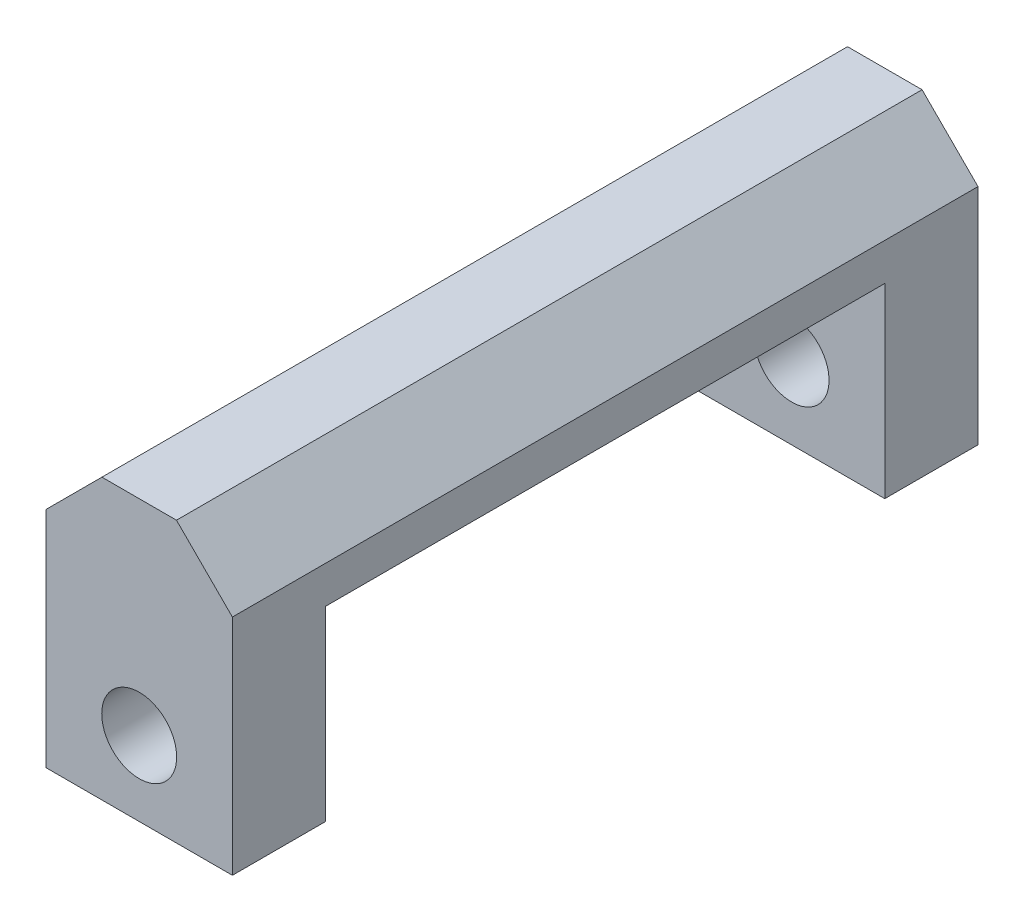
ISO-10303-21;
HEADER;
FILE_DESCRIPTION(('STEP AP214'),'2;1');
FILE_NAME('part.step','',(''),(''),'','','');
FILE_SCHEMA(('AUTOMOTIVE_DESIGN { 1 0 10303 214 1 1 1 1 }'));
ENDSEC;
DATA;
#1=APPLICATION_CONTEXT('core data for automotive mechanical design processes');
#2=APPLICATION_PROTOCOL_DEFINITION('international standard','automotive_design',2000,#1);
#3=PRODUCT_CONTEXT('',#1,'mechanical');
#4=PRODUCT('Part','Part','',(#3));
#5=PRODUCT_RELATED_PRODUCT_CATEGORY('part','',(#4));
#6=PRODUCT_DEFINITION_FORMATION('','',#4);
#7=PRODUCT_DEFINITION_CONTEXT('part definition',#1,'design');
#8=PRODUCT_DEFINITION('design','',#6,#7);
#9=PRODUCT_DEFINITION_SHAPE('','',#8);
#10=(LENGTH_UNIT() NAMED_UNIT(*) SI_UNIT(.MILLI.,.METRE.));
#11=(NAMED_UNIT(*) PLANE_ANGLE_UNIT() SI_UNIT($,.RADIAN.));
#12=(NAMED_UNIT(*) SI_UNIT($,.STERADIAN.) SOLID_ANGLE_UNIT());
#13=UNCERTAINTY_MEASURE_WITH_UNIT(LENGTH_MEASURE(1.E-05),#10,'distance_accuracy_value','');
#14=(GEOMETRIC_REPRESENTATION_CONTEXT(3) GLOBAL_UNCERTAINTY_ASSIGNED_CONTEXT((#13)) GLOBAL_UNIT_ASSIGNED_CONTEXT((#10,
#11,#12)) REPRESENTATION_CONTEXT('',''));
#15=CARTESIAN_POINT('',(0.,0.,0.));
#16=DIRECTION('',(0.,0.,1.));
#17=DIRECTION('',(1.,0.,0.));
#18=AXIS2_PLACEMENT_3D('',#15,#16,#17);
#19=CARTESIAN_POINT('',(12.7,-19.05,-25.4));
#20=DIRECTION('',(0.,1.,0.));
#21=DIRECTION('',(0.,0.,1.));
#22=AXIS2_PLACEMENT_3D('',#19,#20,#21);
#23=PLANE('',#22);
#24=DIRECTION('',(0.,0.,-1.));
#25=VECTOR('',#24,1.);
#26=CARTESIAN_POINT('',(0.,-19.05,-25.4));
#27=LINE('',#26,#25);
#28=CARTESIAN_POINT('',(0.,-19.05,-19.05));
#29=VERTEX_POINT('',#28);
#30=CARTESIAN_POINT('',(0.,-19.05,-25.4));
#31=VERTEX_POINT('',#30);
#32=EDGE_CURVE('E133',#29,#31,#27,.T.);
#33=ORIENTED_EDGE('',*,*,#32,.T.);
#34=DIRECTION('',(-1.,0.,0.));
#35=VECTOR('',#34,1.);
#36=CARTESIAN_POINT('',(12.7,-19.05,-25.4));
#37=LINE('',#36,#35);
#38=CARTESIAN_POINT('',(12.7,-19.05,-25.4));
#39=VERTEX_POINT('',#38);
#40=EDGE_CURVE('E116',#39,#31,#37,.T.);
#41=ORIENTED_EDGE('',*,*,#40,.F.);
#42=DIRECTION('',(0.,0.,-1.));
#43=VECTOR('',#42,1.);
#44=CARTESIAN_POINT('',(12.7,-19.05,-25.4));
#45=LINE('',#44,#43);
#46=CARTESIAN_POINT('',(12.7,-19.05,-19.05));
#47=VERTEX_POINT('',#46);
#48=EDGE_CURVE('E121',#47,#39,#45,.T.);
#49=ORIENTED_EDGE('',*,*,#48,.F.);
#50=DIRECTION('',(-1.,0.,0.));
#51=VECTOR('',#50,1.);
#52=CARTESIAN_POINT('',(12.7,-19.05,-19.05));
#53=LINE('',#52,#51);
#54=EDGE_CURVE('E180',#47,#29,#53,.T.);
#55=ORIENTED_EDGE('',*,*,#54,.T.);
#56=EDGE_LOOP('',(#33,#41,#49,#55));
#57=FACE_BOUND('',#56,.T.);
#58=ADVANCED_FACE('F35',(#57),#23,.F.);
#59=CARTESIAN_POINT('',(12.7,0.,-25.4));
#60=DIRECTION('',(0.,0.,1.));
#61=DIRECTION('',(1.,0.,0.));
#62=AXIS2_PLACEMENT_3D('',#59,#60,#61);
#63=PLANE('',#62);
#64=CARTESIAN_POINT('',(6.35,-13.97,-25.4));
#65=DIRECTION('',(0.,0.,-1.));
#66=DIRECTION('',(-1.,0.,0.));
#67=AXIS2_PLACEMENT_3D('',#64,#65,#66);
#68=CIRCLE('',#67,2.55269999999999);
#69=CARTESIAN_POINT('',(3.79730000000001,-13.97,-25.4));
#70=VERTEX_POINT('',#69);
#71=EDGE_CURVE('E217',#70,#70,#68,.T.);
#72=ORIENTED_EDGE('',*,*,#71,.F.);
#73=EDGE_LOOP('',(#72));
#74=FACE_BOUND('',#73,.T.);
#75=DIRECTION('',(0.,1.,0.));
#76=VECTOR('',#75,1.);
#77=CARTESIAN_POINT('',(0.,0.,-25.4));
#78=LINE('',#77,#76);
#79=CARTESIAN_POINT('',(0.,-3.81000000000002,-25.4));
#80=VERTEX_POINT('',#79);
#81=EDGE_CURVE('E152',#31,#80,#78,.T.);
#82=ORIENTED_EDGE('',*,*,#81,.T.);
#83=DIRECTION('',(0.707106781186546,0.707106781186549,0.));
#84=VECTOR('',#83,1.);
#85=CARTESIAN_POINT('',(3.81,0.,-25.4));
#86=LINE('',#85,#84);
#87=CARTESIAN_POINT('',(3.81,0.,-25.4));
#88=VERTEX_POINT('',#87);
#89=EDGE_CURVE('E43',#80,#88,#86,.T.);
#90=ORIENTED_EDGE('',*,*,#89,.T.);
#91=DIRECTION('',(-1.,0.,0.));
#92=VECTOR('',#91,1.);
#93=CARTESIAN_POINT('',(12.7,0.,-25.4));
#94=LINE('',#93,#92);
#95=CARTESIAN_POINT('',(8.88999999999999,0.,-25.4));
#96=VERTEX_POINT('',#95);
#97=EDGE_CURVE('E135',#96,#88,#94,.T.);
#98=ORIENTED_EDGE('',*,*,#97,.F.);
#99=DIRECTION('',(-0.707106781186548,0.707106781186547,0.));
#100=VECTOR('',#99,1.);
#101=CARTESIAN_POINT('',(12.7,-3.81,-25.4));
#102=LINE('',#101,#100);
#103=CARTESIAN_POINT('',(12.7,-3.81,-25.4));
#104=VERTEX_POINT('',#103);
#105=EDGE_CURVE('E50',#96,#104,#102,.F.);
#106=ORIENTED_EDGE('',*,*,#105,.T.);
#107=DIRECTION('',(0.,1.,0.));
#108=VECTOR('',#107,1.);
#109=CARTESIAN_POINT('',(12.7,0.,-25.4));
#110=LINE('',#109,#108);
#111=EDGE_CURVE('E112',#39,#104,#110,.T.);
#112=ORIENTED_EDGE('',*,*,#111,.F.);
#113=ORIENTED_EDGE('',*,*,#40,.T.);
#114=EDGE_LOOP('',(#82,#90,#98,#106,#112,#113));
#115=FACE_BOUND('',#114,.T.);
#116=ADVANCED_FACE('F114',(#74,#115),#63,.F.);
#117=CARTESIAN_POINT('',(12.7,0.,-25.4));
#118=DIRECTION('',(0.,-1.,0.));
#119=DIRECTION('',(0.,0.,-1.));
#120=AXIS2_PLACEMENT_3D('',#117,#118,#119);
#121=PLANE('',#120);
#122=ORIENTED_EDGE('',*,*,#97,.T.);
#123=DIRECTION('',(0.,0.,1.));
#124=VECTOR('',#123,1.);
#125=CARTESIAN_POINT('',(3.81,0.,25.4));
#126=LINE('',#125,#124);
#127=CARTESIAN_POINT('',(3.81,0.,25.4));
#128=VERTEX_POINT('',#127);
#129=EDGE_CURVE('E137',#88,#128,#126,.T.);
#130=ORIENTED_EDGE('',*,*,#129,.T.);
#131=DIRECTION('',(-1.,0.,0.));
#132=VECTOR('',#131,1.);
#133=CARTESIAN_POINT('',(12.7,0.,25.4));
#134=LINE('',#133,#132);
#135=CARTESIAN_POINT('',(8.88999999999999,0.,25.4));
#136=VERTEX_POINT('',#135);
#137=EDGE_CURVE('E140',#136,#128,#134,.T.);
#138=ORIENTED_EDGE('',*,*,#137,.F.);
#139=DIRECTION('',(0.,0.,-1.));
#140=VECTOR('',#139,1.);
#141=CARTESIAN_POINT('',(8.88999999999999,0.,-25.4));
#142=LINE('',#141,#140);
#143=EDGE_CURVE('E134',#136,#96,#142,.T.);
#144=ORIENTED_EDGE('',*,*,#143,.T.);
#145=EDGE_LOOP('',(#122,#130,#138,#144));
#146=FACE_BOUND('',#145,.T.);
#147=ADVANCED_FACE('F156',(#146),#121,.F.);
#148=CARTESIAN_POINT('',(12.7,0.,25.4));
#149=DIRECTION('',(0.,0.,-1.));
#150=DIRECTION('',(-1.,0.,0.));
#151=AXIS2_PLACEMENT_3D('',#148,#149,#150);
#152=PLANE('',#151);
#153=CARTESIAN_POINT('',(6.35,-13.97,25.4));
#154=DIRECTION('',(0.,0.,-1.));
#155=DIRECTION('',(-1.,0.,0.));
#156=AXIS2_PLACEMENT_3D('',#153,#154,#155);
#157=CIRCLE('',#156,2.55269999999999);
#158=CARTESIAN_POINT('',(3.79730000000001,-13.97,25.4));
#159=VERTEX_POINT('',#158);
#160=EDGE_CURVE('E212',#159,#159,#157,.T.);
#161=ORIENTED_EDGE('',*,*,#160,.T.);
#162=EDGE_LOOP('',(#161));
#163=FACE_BOUND('',#162,.T.);
#164=ORIENTED_EDGE('',*,*,#137,.T.);
#165=DIRECTION('',(-0.707106781186546,-0.707106781186549,0.));
#166=VECTOR('',#165,1.);
#167=CARTESIAN_POINT('',(3.81,0.,25.4));
#168=LINE('',#167,#166);
#169=CARTESIAN_POINT('',(0.,-3.81000000000002,25.4));
#170=VERTEX_POINT('',#169);
#171=EDGE_CURVE('E148',#128,#170,#168,.T.);
#172=ORIENTED_EDGE('',*,*,#171,.T.);
#173=DIRECTION('',(0.,-1.,0.));
#174=VECTOR('',#173,1.);
#175=CARTESIAN_POINT('',(0.,0.,25.4));
#176=LINE('',#175,#174);
#177=CARTESIAN_POINT('',(0.,-19.05,25.4));
#178=VERTEX_POINT('',#177);
#179=EDGE_CURVE('E164',#170,#178,#176,.T.);
#180=ORIENTED_EDGE('',*,*,#179,.T.);
#181=DIRECTION('',(-1.,0.,0.));
#182=VECTOR('',#181,1.);
#183=CARTESIAN_POINT('',(12.7,-19.05,25.4));
#184=LINE('',#183,#182);
#185=CARTESIAN_POINT('',(12.7,-19.05,25.4));
#186=VERTEX_POINT('',#185);
#187=EDGE_CURVE('E191',#186,#178,#184,.T.);
#188=ORIENTED_EDGE('',*,*,#187,.F.);
#189=DIRECTION('',(0.,-1.,0.));
#190=VECTOR('',#189,1.);
#191=CARTESIAN_POINT('',(12.7,0.,25.4));
#192=LINE('',#191,#190);
#193=CARTESIAN_POINT('',(12.7,-3.81,25.4));
#194=VERTEX_POINT('',#193);
#195=EDGE_CURVE('E120',#194,#186,#192,.T.);
#196=ORIENTED_EDGE('',*,*,#195,.F.);
#197=DIRECTION('',(0.707106781186548,-0.707106781186547,0.));
#198=VECTOR('',#197,1.);
#199=CARTESIAN_POINT('',(12.7,-3.81,25.4));
#200=LINE('',#199,#198);
#201=EDGE_CURVE('E146',#194,#136,#200,.F.);
#202=ORIENTED_EDGE('',*,*,#201,.T.);
#203=EDGE_LOOP('',(#164,#172,#180,#188,#196,#202));
#204=FACE_BOUND('',#203,.T.);
#205=ADVANCED_FACE('F162',(#163,#204),#152,.F.);
#206=CARTESIAN_POINT('',(12.7,-19.05,25.4));
#207=DIRECTION('',(0.,1.,0.));
#208=DIRECTION('',(0.,0.,1.));
#209=AXIS2_PLACEMENT_3D('',#206,#207,#208);
#210=PLANE('',#209);
#211=DIRECTION('',(0.,0.,-1.));
#212=VECTOR('',#211,1.);
#213=CARTESIAN_POINT('',(0.,-19.05,25.4));
#214=LINE('',#213,#212);
#215=CARTESIAN_POINT('',(0.,-19.05,19.05));
#216=VERTEX_POINT('',#215);
#217=EDGE_CURVE('E169',#178,#216,#214,.T.);
#218=ORIENTED_EDGE('',*,*,#217,.T.);
#219=DIRECTION('',(-1.,0.,0.));
#220=VECTOR('',#219,1.);
#221=CARTESIAN_POINT('',(12.7,-19.05,19.05));
#222=LINE('',#221,#220);
#223=CARTESIAN_POINT('',(12.7,-19.05,19.05));
#224=VERTEX_POINT('',#223);
#225=EDGE_CURVE('E188',#224,#216,#222,.T.);
#226=ORIENTED_EDGE('',*,*,#225,.F.);
#227=DIRECTION('',(0.,0.,-1.));
#228=VECTOR('',#227,1.);
#229=CARTESIAN_POINT('',(12.7,-19.05,25.4));
#230=LINE('',#229,#228);
#231=EDGE_CURVE('E196',#186,#224,#230,.T.);
#232=ORIENTED_EDGE('',*,*,#231,.F.);
#233=ORIENTED_EDGE('',*,*,#187,.T.);
#234=EDGE_LOOP('',(#218,#226,#232,#233));
#235=FACE_BOUND('',#234,.T.);
#236=ADVANCED_FACE('F194',(#235),#210,.F.);
#237=CARTESIAN_POINT('',(12.7,-19.05,19.05));
#238=DIRECTION('',(0.,0.,1.));
#239=DIRECTION('',(1.,0.,0.));
#240=AXIS2_PLACEMENT_3D('',#237,#238,#239);
#241=PLANE('',#240);
#242=CARTESIAN_POINT('',(6.35,-13.97,19.05));
#243=DIRECTION('',(0.,0.,1.));
#244=DIRECTION('',(1.,0.,0.));
#245=AXIS2_PLACEMENT_3D('',#242,#243,#244);
#246=CIRCLE('',#245,2.55269999999999);
#247=CARTESIAN_POINT('',(8.90269999999999,-13.97,19.05));
#248=VERTEX_POINT('',#247);
#249=EDGE_CURVE('E207',#248,#248,#246,.T.);
#250=ORIENTED_EDGE('',*,*,#249,.T.);
#251=EDGE_LOOP('',(#250));
#252=FACE_BOUND('',#251,.T.);
#253=DIRECTION('',(0.,1.,0.));
#254=VECTOR('',#253,1.);
#255=CARTESIAN_POINT('',(0.,-19.05,19.05));
#256=LINE('',#255,#254);
#257=CARTESIAN_POINT('',(0.,-6.35,19.05));
#258=VERTEX_POINT('',#257);
#259=EDGE_CURVE('E171',#216,#258,#256,.T.);
#260=ORIENTED_EDGE('',*,*,#259,.T.);
#261=DIRECTION('',(-1.,0.,0.));
#262=VECTOR('',#261,1.);
#263=CARTESIAN_POINT('',(12.7,-6.35,19.05));
#264=LINE('',#263,#262);
#265=CARTESIAN_POINT('',(12.7,-6.35,19.05));
#266=VERTEX_POINT('',#265);
#267=EDGE_CURVE('E185',#266,#258,#264,.T.);
#268=ORIENTED_EDGE('',*,*,#267,.F.);
#269=DIRECTION('',(0.,1.,0.));
#270=VECTOR('',#269,1.);
#271=CARTESIAN_POINT('',(12.7,-19.05,19.05));
#272=LINE('',#271,#270);
#273=EDGE_CURVE('E199',#224,#266,#272,.T.);
#274=ORIENTED_EDGE('',*,*,#273,.F.);
#275=ORIENTED_EDGE('',*,*,#225,.T.);
#276=EDGE_LOOP('',(#260,#268,#274,#275));
#277=FACE_BOUND('',#276,.T.);
#278=ADVANCED_FACE('F256',(#252,#277),#241,.F.);
#279=CARTESIAN_POINT('',(12.7,-6.35,19.05));
#280=DIRECTION('',(0.,1.,0.));
#281=DIRECTION('',(0.,0.,1.));
#282=AXIS2_PLACEMENT_3D('',#279,#280,#281);
#283=PLANE('',#282);
#284=DIRECTION('',(0.,0.,-1.));
#285=VECTOR('',#284,1.);
#286=CARTESIAN_POINT('',(0.,-6.35,19.05));
#287=LINE('',#286,#285);
#288=CARTESIAN_POINT('',(0.,-6.35,-19.05));
#289=VERTEX_POINT('',#288);
#290=EDGE_CURVE('E177',#258,#289,#287,.T.);
#291=ORIENTED_EDGE('',*,*,#290,.T.);
#292=DIRECTION('',(-1.,0.,0.));
#293=VECTOR('',#292,1.);
#294=CARTESIAN_POINT('',(12.7,-6.35,-19.05));
#295=LINE('',#294,#293);
#296=CARTESIAN_POINT('',(12.7,-6.35,-19.05));
#297=VERTEX_POINT('',#296);
#298=EDGE_CURVE('E182',#297,#289,#295,.T.);
#299=ORIENTED_EDGE('',*,*,#298,.F.);
#300=DIRECTION('',(0.,0.,-1.));
#301=VECTOR('',#300,1.);
#302=CARTESIAN_POINT('',(12.7,-6.35,19.05));
#303=LINE('',#302,#301);
#304=EDGE_CURVE('E203',#266,#297,#303,.T.);
#305=ORIENTED_EDGE('',*,*,#304,.F.);
#306=ORIENTED_EDGE('',*,*,#267,.T.);
#307=EDGE_LOOP('',(#291,#299,#305,#306));
#308=FACE_BOUND('',#307,.T.);
#309=ADVANCED_FACE('F253',(#308),#283,.F.);
#310=CARTESIAN_POINT('',(12.7,-19.05,-19.05));
#311=DIRECTION('',(0.,0.,-1.));
#312=DIRECTION('',(-1.,0.,0.));
#313=AXIS2_PLACEMENT_3D('',#310,#311,#312);
#314=PLANE('',#313);
#315=CARTESIAN_POINT('',(6.35,-13.97,-19.05));
#316=DIRECTION('',(0.,0.,-1.));
#317=DIRECTION('',(-1.,0.,0.));
#318=AXIS2_PLACEMENT_3D('',#315,#316,#317);
#319=CIRCLE('',#318,2.55269999999999);
#320=CARTESIAN_POINT('',(3.79730000000001,-13.97,-19.05));
#321=VERTEX_POINT('',#320);
#322=EDGE_CURVE('E205',#321,#321,#319,.T.);
#323=ORIENTED_EDGE('',*,*,#322,.T.);
#324=EDGE_LOOP('',(#323));
#325=FACE_BOUND('',#324,.T.);
#326=DIRECTION('',(0.,-1.,0.));
#327=VECTOR('',#326,1.);
#328=CARTESIAN_POINT('',(0.,-19.05,-19.05));
#329=LINE('',#328,#327);
#330=EDGE_CURVE('E130',#289,#29,#329,.T.);
#331=ORIENTED_EDGE('',*,*,#330,.T.);
#332=ORIENTED_EDGE('',*,*,#54,.F.);
#333=DIRECTION('',(0.,-1.,0.));
#334=VECTOR('',#333,1.);
#335=CARTESIAN_POINT('',(12.7,-19.05,-19.05));
#336=LINE('',#335,#334);
#337=EDGE_CURVE('E126',#297,#47,#336,.T.);
#338=ORIENTED_EDGE('',*,*,#337,.F.);
#339=ORIENTED_EDGE('',*,*,#298,.T.);
#340=EDGE_LOOP('',(#331,#332,#338,#339));
#341=FACE_BOUND('',#340,.T.);
#342=ADVANCED_FACE('F248',(#325,#341),#314,.F.);
#343=CARTESIAN_POINT('',(12.7,0.,0.));
#344=DIRECTION('',(-1.,0.,0.));
#345=DIRECTION('',(0.,0.,1.));
#346=AXIS2_PLACEMENT_3D('',#343,#344,#345);
#347=PLANE('',#346);
#348=ORIENTED_EDGE('',*,*,#111,.T.);
#349=DIRECTION('',(0.,0.,1.));
#350=VECTOR('',#349,1.);
#351=CARTESIAN_POINT('',(12.7,-3.81,0.));
#352=LINE('',#351,#350);
#353=EDGE_CURVE('E11',#104,#194,#352,.T.);
#354=ORIENTED_EDGE('',*,*,#353,.T.);
#355=ORIENTED_EDGE('',*,*,#195,.T.);
#356=ORIENTED_EDGE('',*,*,#231,.T.);
#357=ORIENTED_EDGE('',*,*,#273,.T.);
#358=ORIENTED_EDGE('',*,*,#304,.T.);
#359=ORIENTED_EDGE('',*,*,#337,.T.);
#360=ORIENTED_EDGE('',*,*,#48,.T.);
#361=EDGE_LOOP('',(#348,#354,#355,#356,#357,#358,#359,#360));
#362=FACE_BOUND('',#361,.T.);
#363=ADVANCED_FACE('F124',(#362),#347,.F.);
#364=CARTESIAN_POINT('',(0.,0.,0.));
#365=DIRECTION('',(-1.,0.,0.));
#366=DIRECTION('',(0.,0.,1.));
#367=AXIS2_PLACEMENT_3D('',#364,#365,#366);
#368=PLANE('',#367);
#369=ORIENTED_EDGE('',*,*,#179,.F.);
#370=DIRECTION('',(0.,0.,-1.));
#371=VECTOR('',#370,1.);
#372=CARTESIAN_POINT('',(0.,-3.81000000000002,-25.4));
#373=LINE('',#372,#371);
#374=EDGE_CURVE('E58',#170,#80,#373,.T.);
#375=ORIENTED_EDGE('',*,*,#374,.T.);
#376=ORIENTED_EDGE('',*,*,#81,.F.);
#377=ORIENTED_EDGE('',*,*,#32,.F.);
#378=ORIENTED_EDGE('',*,*,#330,.F.);
#379=ORIENTED_EDGE('',*,*,#290,.F.);
#380=ORIENTED_EDGE('',*,*,#259,.F.);
#381=ORIENTED_EDGE('',*,*,#217,.F.);
#382=EDGE_LOOP('',(#369,#375,#376,#377,#378,#379,#380,#381));
#383=FACE_BOUND('',#382,.T.);
#384=ADVANCED_FACE('F167',(#383),#368,.T.);
#385=CARTESIAN_POINT('',(6.35,-13.97,-25.4));
#386=DIRECTION('',(0.,0.,-1.));
#387=DIRECTION('',(-1.,0.,0.));
#388=AXIS2_PLACEMENT_3D('',#385,#386,#387);
#389=CYLINDRICAL_SURFACE('',#388,2.55269999999999);
#390=ORIENTED_EDGE('',*,*,#160,.F.);
#391=EDGE_LOOP('',(#390));
#392=FACE_BOUND('',#391,.T.);
#393=ORIENTED_EDGE('',*,*,#249,.F.);
#394=EDGE_LOOP('',(#393));
#395=FACE_BOUND('',#394,.T.);
#396=ADVANCED_FACE('F240',(#392,#395),#389,.F.);
#397=ORIENTED_EDGE('',*,*,#71,.T.);
#398=EDGE_LOOP('',(#397));
#399=FACE_BOUND('',#398,.T.);
#400=ORIENTED_EDGE('',*,*,#322,.F.);
#401=EDGE_LOOP('',(#400));
#402=FACE_BOUND('',#401,.T.);
#403=ADVANCED_FACE('F221',(#399,#402),#389,.F.);
#404=CARTESIAN_POINT('',(3.81,0.,-25.4));
#405=DIRECTION('',(-0.707106781186549,0.707106781186546,0.));
#406=DIRECTION('',(0.,0.,-1.));
#407=AXIS2_PLACEMENT_3D('',#404,#405,#406);
#408=PLANE('',#407);
#409=ORIENTED_EDGE('',*,*,#89,.F.);
#410=ORIENTED_EDGE('',*,*,#374,.F.);
#411=ORIENTED_EDGE('',*,*,#171,.F.);
#412=ORIENTED_EDGE('',*,*,#129,.F.);
#413=EDGE_LOOP('',(#409,#410,#411,#412));
#414=FACE_BOUND('',#413,.T.);
#415=ADVANCED_FACE('F160',(#414),#408,.T.);
#416=CARTESIAN_POINT('',(12.7,-3.81,0.));
#417=DIRECTION('',(-0.707106781186547,-0.707106781186548,0.));
#418=DIRECTION('',(0.,0.,1.));
#419=AXIS2_PLACEMENT_3D('',#416,#417,#418);
#420=PLANE('',#419);
#421=ORIENTED_EDGE('',*,*,#105,.F.);
#422=ORIENTED_EDGE('',*,*,#143,.F.);
#423=ORIENTED_EDGE('',*,*,#201,.F.);
#424=ORIENTED_EDGE('',*,*,#353,.F.);
#425=EDGE_LOOP('',(#421,#422,#423,#424));
#426=FACE_BOUND('',#425,.T.);
#427=ADVANCED_FACE('F37',(#426),#420,.F.);
#428=CLOSED_SHELL('',(#58,#116,#147,#205,#236,#278,#309,#342,#363,#384,#396,#403,#415,#427));
#429=MANIFOLD_SOLID_BREP('B2',#428);
#430=ADVANCED_BREP_SHAPE_REPRESENTATION('',(#18,#429),#14);
#431=SHAPE_DEFINITION_REPRESENTATION(#9,#430);
ENDSEC;
END-ISO-10303-21;
